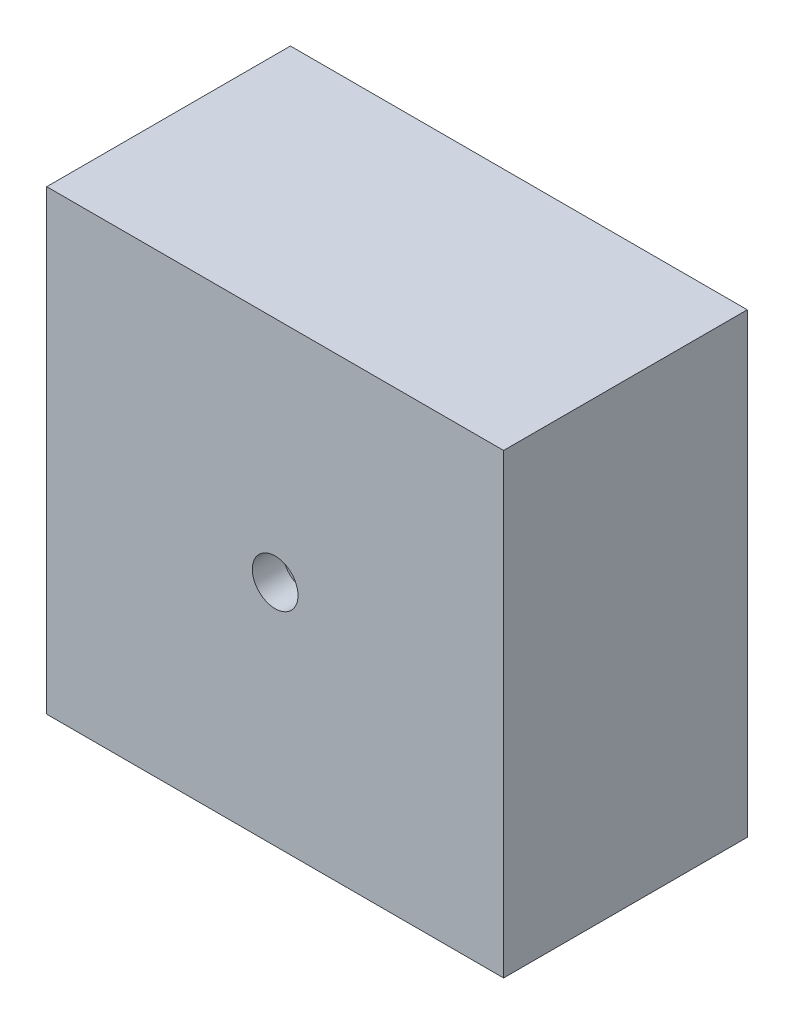
ISO-10303-21;
HEADER;
FILE_DESCRIPTION(('STEP AP214'),'2;1');
FILE_NAME('part.step','',(''),(''),'','','');
FILE_SCHEMA(('AUTOMOTIVE_DESIGN { 1 0 10303 214 1 1 1 1 }'));
ENDSEC;
DATA;
#1=APPLICATION_CONTEXT('core data for automotive mechanical design processes');
#2=APPLICATION_PROTOCOL_DEFINITION('international standard','automotive_design',2000,#1);
#3=PRODUCT_CONTEXT('',#1,'mechanical');
#4=PRODUCT('Part','Part','',(#3));
#5=PRODUCT_RELATED_PRODUCT_CATEGORY('part','',(#4));
#6=PRODUCT_DEFINITION_FORMATION('','',#4);
#7=PRODUCT_DEFINITION_CONTEXT('part definition',#1,'design');
#8=PRODUCT_DEFINITION('design','',#6,#7);
#9=PRODUCT_DEFINITION_SHAPE('','',#8);
#10=(LENGTH_UNIT() NAMED_UNIT(*) SI_UNIT(.MILLI.,.METRE.));
#11=(NAMED_UNIT(*) PLANE_ANGLE_UNIT() SI_UNIT($,.RADIAN.));
#12=(NAMED_UNIT(*) SI_UNIT($,.STERADIAN.) SOLID_ANGLE_UNIT());
#13=UNCERTAINTY_MEASURE_WITH_UNIT(LENGTH_MEASURE(1.E-05),#10,'distance_accuracy_value','');
#14=(GEOMETRIC_REPRESENTATION_CONTEXT(3) GLOBAL_UNCERTAINTY_ASSIGNED_CONTEXT((#13)) GLOBAL_UNIT_ASSIGNED_CONTEXT((#10,
#11,#12)) REPRESENTATION_CONTEXT('',''));
#15=CARTESIAN_POINT('',(0.,0.,0.));
#16=DIRECTION('',(0.,0.,1.));
#17=DIRECTION('',(1.,0.,0.));
#18=AXIS2_PLACEMENT_3D('',#15,#16,#17);
#19=CARTESIAN_POINT('',(15.,-15.,6.));
#20=DIRECTION('',(-1.,0.,0.));
#21=DIRECTION('',(0.,0.,1.));
#22=AXIS2_PLACEMENT_3D('',#19,#20,#21);
#23=PLANE('',#22);
#24=DIRECTION('',(0.,0.,-1.));
#25=VECTOR('',#24,1.);
#26=CARTESIAN_POINT('',(15.,-15.,6.));
#27=LINE('',#26,#25);
#28=CARTESIAN_POINT('',(15.,-15.,8.));
#29=VERTEX_POINT('',#28);
#30=CARTESIAN_POINT('',(15.,-15.,-8.));
#31=VERTEX_POINT('',#30);
#32=EDGE_CURVE('E96',#29,#31,#27,.T.);
#33=ORIENTED_EDGE('',*,*,#32,.T.);
#34=DIRECTION('',(0.,1.,0.));
#35=VECTOR('',#34,1.);
#36=CARTESIAN_POINT('',(15.,-15.,-8.));
#37=LINE('',#36,#35);
#38=CARTESIAN_POINT('',(15.,15.,-8.));
#39=VERTEX_POINT('',#38);
#40=EDGE_CURVE('E108',#31,#39,#37,.T.);
#41=ORIENTED_EDGE('',*,*,#40,.T.);
#42=DIRECTION('',(0.,0.,-1.));
#43=VECTOR('',#42,1.);
#44=CARTESIAN_POINT('',(15.,15.,6.));
#45=LINE('',#44,#43);
#46=CARTESIAN_POINT('',(15.,15.,8.));
#47=VERTEX_POINT('',#46);
#48=EDGE_CURVE('E12',#47,#39,#45,.T.);
#49=ORIENTED_EDGE('',*,*,#48,.F.);
#50=DIRECTION('',(0.,1.,0.));
#51=VECTOR('',#50,1.);
#52=CARTESIAN_POINT('',(15.,-15.,8.));
#53=LINE('',#52,#51);
#54=EDGE_CURVE('E120',#29,#47,#53,.T.);
#55=ORIENTED_EDGE('',*,*,#54,.F.);
#56=EDGE_LOOP('',(#33,#41,#49,#55));
#57=FACE_BOUND('',#56,.T.);
#58=ADVANCED_FACE('F51',(#57),#23,.F.);
#59=CARTESIAN_POINT('',(-15.,15.,6.));
#60=DIRECTION('',(0.,-1.,0.));
#61=DIRECTION('',(0.,0.,-1.));
#62=AXIS2_PLACEMENT_3D('',#59,#60,#61);
#63=PLANE('',#62);
#64=ORIENTED_EDGE('',*,*,#48,.T.);
#65=DIRECTION('',(-1.,0.,0.));
#66=VECTOR('',#65,1.);
#67=CARTESIAN_POINT('',(15.,15.,-8.));
#68=LINE('',#67,#66);
#69=CARTESIAN_POINT('',(-15.,15.,-8.));
#70=VERTEX_POINT('',#69);
#71=EDGE_CURVE('E109',#39,#70,#68,.T.);
#72=ORIENTED_EDGE('',*,*,#71,.T.);
#73=DIRECTION('',(0.,0.,-1.));
#74=VECTOR('',#73,1.);
#75=CARTESIAN_POINT('',(-15.,15.,6.));
#76=LINE('',#75,#74);
#77=CARTESIAN_POINT('',(-15.,15.,8.));
#78=VERTEX_POINT('',#77);
#79=EDGE_CURVE('E56',#78,#70,#76,.T.);
#80=ORIENTED_EDGE('',*,*,#79,.F.);
#81=DIRECTION('',(-1.,0.,0.));
#82=VECTOR('',#81,1.);
#83=CARTESIAN_POINT('',(15.,15.,8.));
#84=LINE('',#83,#82);
#85=EDGE_CURVE('E119',#47,#78,#84,.T.);
#86=ORIENTED_EDGE('',*,*,#85,.F.);
#87=EDGE_LOOP('',(#64,#72,#80,#86));
#88=FACE_BOUND('',#87,.T.);
#89=ADVANCED_FACE('F133',(#88),#63,.F.);
#90=CARTESIAN_POINT('',(-15.,-15.,6.));
#91=DIRECTION('',(1.,0.,0.));
#92=DIRECTION('',(0.,0.,-1.));
#93=AXIS2_PLACEMENT_3D('',#90,#91,#92);
#94=PLANE('',#93);
#95=ORIENTED_EDGE('',*,*,#79,.T.);
#96=DIRECTION('',(0.,-1.,0.));
#97=VECTOR('',#96,1.);
#98=CARTESIAN_POINT('',(-15.,15.,-8.));
#99=LINE('',#98,#97);
#100=CARTESIAN_POINT('',(-15.,-15.,-8.));
#101=VERTEX_POINT('',#100);
#102=EDGE_CURVE('E105',#70,#101,#99,.T.);
#103=ORIENTED_EDGE('',*,*,#102,.T.);
#104=DIRECTION('',(0.,0.,-1.));
#105=VECTOR('',#104,1.);
#106=CARTESIAN_POINT('',(-15.,-15.,6.));
#107=LINE('',#106,#105);
#108=CARTESIAN_POINT('',(-15.,-15.,8.));
#109=VERTEX_POINT('',#108);
#110=EDGE_CURVE('E66',#109,#101,#107,.T.);
#111=ORIENTED_EDGE('',*,*,#110,.F.);
#112=DIRECTION('',(0.,-1.,0.));
#113=VECTOR('',#112,1.);
#114=CARTESIAN_POINT('',(-15.,15.,8.));
#115=LINE('',#114,#113);
#116=EDGE_CURVE('E125',#78,#109,#115,.T.);
#117=ORIENTED_EDGE('',*,*,#116,.F.);
#118=EDGE_LOOP('',(#95,#103,#111,#117));
#119=FACE_BOUND('',#118,.T.);
#120=ADVANCED_FACE('F110',(#119),#94,.F.);
#121=CARTESIAN_POINT('',(-15.,-15.,6.));
#122=DIRECTION('',(0.,1.,0.));
#123=DIRECTION('',(0.,0.,1.));
#124=AXIS2_PLACEMENT_3D('',#121,#122,#123);
#125=PLANE('',#124);
#126=ORIENTED_EDGE('',*,*,#110,.T.);
#127=DIRECTION('',(1.,0.,0.));
#128=VECTOR('',#127,1.);
#129=CARTESIAN_POINT('',(-15.,-15.,-8.));
#130=LINE('',#129,#128);
#131=EDGE_CURVE('E93',#101,#31,#130,.T.);
#132=ORIENTED_EDGE('',*,*,#131,.T.);
#133=ORIENTED_EDGE('',*,*,#32,.F.);
#134=DIRECTION('',(1.,0.,0.));
#135=VECTOR('',#134,1.);
#136=CARTESIAN_POINT('',(-15.,-15.,8.));
#137=LINE('',#136,#135);
#138=EDGE_CURVE('E100',#109,#29,#137,.T.);
#139=ORIENTED_EDGE('',*,*,#138,.F.);
#140=EDGE_LOOP('',(#126,#132,#133,#139));
#141=FACE_BOUND('',#140,.T.);
#142=ADVANCED_FACE('F94',(#141),#125,.F.);
#143=CARTESIAN_POINT('',(0.,0.,8.));
#144=DIRECTION('',(0.,0.,1.));
#145=DIRECTION('',(1.,0.,0.));
#146=AXIS2_PLACEMENT_3D('',#143,#144,#145);
#147=PLANE('',#146);
#148=CARTESIAN_POINT('',(0.,0.,8.));
#149=DIRECTION('',(0.,0.,1.));
#150=DIRECTION('',(1.,0.,0.));
#151=AXIS2_PLACEMENT_3D('',#148,#149,#150);
#152=CIRCLE('',#151,1.5);
#153=CARTESIAN_POINT('',(1.5,0.,8.));
#154=VERTEX_POINT('',#153);
#155=EDGE_CURVE('E180',#154,#154,#152,.T.);
#156=ORIENTED_EDGE('',*,*,#155,.F.);
#157=EDGE_LOOP('',(#156));
#158=FACE_BOUND('',#157,.T.);
#159=ORIENTED_EDGE('',*,*,#138,.T.);
#160=ORIENTED_EDGE('',*,*,#54,.T.);
#161=ORIENTED_EDGE('',*,*,#85,.T.);
#162=ORIENTED_EDGE('',*,*,#116,.T.);
#163=EDGE_LOOP('',(#159,#160,#161,#162));
#164=FACE_BOUND('',#163,.T.);
#165=ADVANCED_FACE('F131',(#158,#164),#147,.T.);
#166=CARTESIAN_POINT('',(0.,0.,-8.));
#167=DIRECTION('',(0.,0.,-1.));
#168=DIRECTION('',(1.,0.,0.));
#169=AXIS2_PLACEMENT_3D('',#166,#167,#168);
#170=PLANE('',#169);
#171=CARTESIAN_POINT('',(0.,0.,-8.));
#172=DIRECTION('',(0.,0.,1.));
#173=DIRECTION('',(1.,0.,0.));
#174=AXIS2_PLACEMENT_3D('',#171,#172,#173);
#175=CIRCLE('',#174,1.5);
#176=CARTESIAN_POINT('',(1.5,0.,-8.));
#177=VERTEX_POINT('',#176);
#178=EDGE_CURVE('E174',#177,#177,#175,.T.);
#179=ORIENTED_EDGE('',*,*,#178,.T.);
#180=EDGE_LOOP('',(#179));
#181=FACE_BOUND('',#180,.T.);
#182=ORIENTED_EDGE('',*,*,#131,.F.);
#183=ORIENTED_EDGE('',*,*,#102,.F.);
#184=ORIENTED_EDGE('',*,*,#71,.F.);
#185=ORIENTED_EDGE('',*,*,#40,.F.);
#186=EDGE_LOOP('',(#182,#183,#184,#185));
#187=FACE_BOUND('',#186,.T.);
#188=ADVANCED_FACE('F104',(#181,#187),#170,.T.);
#189=CARTESIAN_POINT('',(0.,0.,-8.));
#190=DIRECTION('',(0.,0.,1.));
#191=DIRECTION('',(1.,0.,0.));
#192=AXIS2_PLACEMENT_3D('',#189,#190,#191);
#193=CYLINDRICAL_SURFACE('',#192,1.5);
#194=ORIENTED_EDGE('',*,*,#155,.T.);
#195=EDGE_LOOP('',(#194));
#196=FACE_BOUND('',#195,.T.);
#197=CARTESIAN_POINT('',(0.,0.,6.));
#198=DIRECTION('',(0.,0.,1.));
#199=DIRECTION('',(1.,0.,0.));
#200=AXIS2_PLACEMENT_3D('',#197,#198,#199);
#201=CIRCLE('',#200,1.5);
#202=CARTESIAN_POINT('',(1.5,0.,6.));
#203=VERTEX_POINT('',#202);
#204=EDGE_CURVE('E53',#203,#203,#201,.T.);
#205=ORIENTED_EDGE('',*,*,#204,.F.);
#206=EDGE_LOOP('',(#205));
#207=FACE_BOUND('',#206,.T.);
#208=ADVANCED_FACE('F164',(#196,#207),#193,.F.);
#209=ORIENTED_EDGE('',*,*,#178,.F.);
#210=EDGE_LOOP('',(#209));
#211=FACE_BOUND('',#210,.T.);
#212=CARTESIAN_POINT('',(0.,0.,-6.));
#213=DIRECTION('',(0.,0.,-1.));
#214=DIRECTION('',(-1.,0.,0.));
#215=AXIS2_PLACEMENT_3D('',#212,#213,#214);
#216=CIRCLE('',#215,1.5);
#217=CARTESIAN_POINT('',(-1.5,0.,-6.));
#218=VERTEX_POINT('',#217);
#219=EDGE_CURVE('E107',#218,#218,#216,.T.);
#220=ORIENTED_EDGE('',*,*,#219,.F.);
#221=EDGE_LOOP('',(#220));
#222=FACE_BOUND('',#221,.T.);
#223=ADVANCED_FACE('F159',(#211,#222),#193,.F.);
#224=CARTESIAN_POINT('',(0.,0.,-6.));
#225=DIRECTION('',(0.,0.,-1.));
#226=DIRECTION('',(1.,0.,0.));
#227=AXIS2_PLACEMENT_3D('',#224,#225,#226);
#228=PLANE('',#227);
#229=ORIENTED_EDGE('',*,*,#219,.T.);
#230=EDGE_LOOP('',(#229));
#231=FACE_BOUND('',#230,.T.);
#232=CARTESIAN_POINT('',(0.,0.,-6.));
#233=DIRECTION('',(0.,0.,1.));
#234=DIRECTION('',(1.,0.,0.));
#235=AXIS2_PLACEMENT_3D('',#232,#233,#234);
#236=CIRCLE('',#235,12.);
#237=CARTESIAN_POINT('',(12.,0.,-6.));
#238=VERTEX_POINT('',#237);
#239=EDGE_CURVE('E130',#238,#238,#236,.T.);
#240=ORIENTED_EDGE('',*,*,#239,.T.);
#241=EDGE_LOOP('',(#240));
#242=FACE_BOUND('',#241,.T.);
#243=ADVANCED_FACE('F154',(#231,#242),#228,.F.);
#244=CARTESIAN_POINT('',(0.,0.,6.));
#245=DIRECTION('',(0.,0.,1.));
#246=DIRECTION('',(1.,0.,0.));
#247=AXIS2_PLACEMENT_3D('',#244,#245,#246);
#248=PLANE('',#247);
#249=ORIENTED_EDGE('',*,*,#204,.T.);
#250=EDGE_LOOP('',(#249));
#251=FACE_BOUND('',#250,.T.);
#252=CARTESIAN_POINT('',(0.,0.,6.));
#253=DIRECTION('',(0.,0.,1.));
#254=DIRECTION('',(1.,0.,0.));
#255=AXIS2_PLACEMENT_3D('',#252,#253,#254);
#256=CIRCLE('',#255,12.);
#257=CARTESIAN_POINT('',(12.,0.,6.));
#258=VERTEX_POINT('',#257);
#259=EDGE_CURVE('E122',#258,#258,#256,.T.);
#260=ORIENTED_EDGE('',*,*,#259,.F.);
#261=EDGE_LOOP('',(#260));
#262=FACE_BOUND('',#261,.T.);
#263=ADVANCED_FACE('F146',(#251,#262),#248,.F.);
#264=CARTESIAN_POINT('',(0.,0.,6.));
#265=DIRECTION('',(0.,0.,-1.));
#266=DIRECTION('',(-1.,0.,0.));
#267=AXIS2_PLACEMENT_3D('',#264,#265,#266);
#268=CYLINDRICAL_SURFACE('',#267,12.);
#269=ORIENTED_EDGE('',*,*,#259,.T.);
#270=EDGE_LOOP('',(#269));
#271=FACE_BOUND('',#270,.T.);
#272=ORIENTED_EDGE('',*,*,#239,.F.);
#273=EDGE_LOOP('',(#272));
#274=FACE_BOUND('',#273,.T.);
#275=ADVANCED_FACE('F145',(#271,#274),#268,.F.);
#276=CLOSED_SHELL('',(#58,#89,#120,#142,#165,#188,#208,#223,#243,#263,#275));
#277=MANIFOLD_SOLID_BREP('B2',#276);
#278=CARTESIAN_POINT('',(0.,0.,5.));
#279=DIRECTION('',(0.,0.,-1.));
#280=DIRECTION('',(-1.,0.,0.));
#281=AXIS2_PLACEMENT_3D('',#278,#279,#280);
#282=CYLINDRICAL_SURFACE('',#281,10.);
#283=CARTESIAN_POINT('',(0.,0.,5.));
#284=DIRECTION('',(0.,0.,1.));
#285=DIRECTION('',(1.,0.,0.));
#286=AXIS2_PLACEMENT_3D('',#283,#284,#285);
#287=CIRCLE('',#286,10.);
#288=CARTESIAN_POINT('',(10.,0.,5.));
#289=VERTEX_POINT('',#288);
#290=EDGE_CURVE('E49',#289,#289,#287,.T.);
#291=ORIENTED_EDGE('',*,*,#290,.F.);
#292=EDGE_LOOP('',(#291));
#293=FACE_BOUND('',#292,.T.);
#294=CARTESIAN_POINT('',(0.,0.,-5.));
#295=DIRECTION('',(0.,0.,1.));
#296=DIRECTION('',(1.,0.,0.));
#297=AXIS2_PLACEMENT_3D('',#294,#295,#296);
#298=CIRCLE('',#297,10.);
#299=CARTESIAN_POINT('',(10.,0.,-5.));
#300=VERTEX_POINT('',#299);
#301=EDGE_CURVE('E285',#300,#300,#298,.T.);
#302=ORIENTED_EDGE('',*,*,#301,.T.);
#303=EDGE_LOOP('',(#302));
#304=FACE_BOUND('',#303,.T.);
#305=ADVANCED_FACE('F278',(#293,#304),#282,.T.);
#306=CARTESIAN_POINT('',(0.,0.,5.));
#307=DIRECTION('',(0.,0.,1.));
#308=DIRECTION('',(1.,0.,0.));
#309=AXIS2_PLACEMENT_3D('',#306,#307,#308);
#310=PLANE('',#309);
#311=ORIENTED_EDGE('',*,*,#290,.T.);
#312=EDGE_LOOP('',(#311));
#313=FACE_BOUND('',#312,.T.);
#314=ADVANCED_FACE('F293',(#313),#310,.T.);
#315=CARTESIAN_POINT('',(0.,0.,-5.));
#316=DIRECTION('',(0.,0.,1.));
#317=DIRECTION('',(1.,0.,0.));
#318=AXIS2_PLACEMENT_3D('',#315,#316,#317);
#319=PLANE('',#318);
#320=ORIENTED_EDGE('',*,*,#301,.F.);
#321=EDGE_LOOP('',(#320));
#322=FACE_BOUND('',#321,.T.);
#323=ADVANCED_FACE('F292',(#322),#319,.F.);
#324=CLOSED_SHELL('',(#305,#314,#323));
#325=MANIFOLD_SOLID_BREP('B6',#324);
#326=ADVANCED_BREP_SHAPE_REPRESENTATION('',(#18,#277,#325),#14);
#327=SHAPE_DEFINITION_REPRESENTATION(#9,#326);
ENDSEC;
END-ISO-10303-21;
